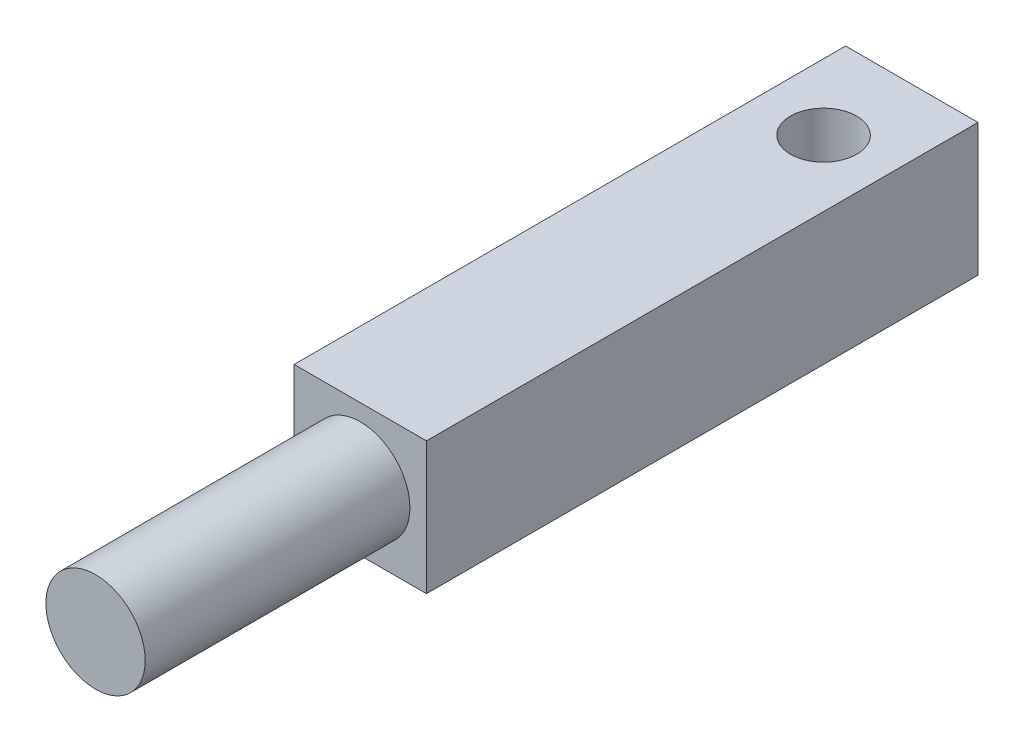
ISO-10303-21;
HEADER;
FILE_DESCRIPTION(('STEP AP214'),'2;1');
FILE_NAME('part.step','',(''),(''),'','','');
FILE_SCHEMA(('AUTOMOTIVE_DESIGN { 1 0 10303 214 1 1 1 1 }'));
ENDSEC;
DATA;
#1=APPLICATION_CONTEXT('core data for automotive mechanical design processes');
#2=APPLICATION_PROTOCOL_DEFINITION('international standard','automotive_design',2000,#1);
#3=PRODUCT_CONTEXT('',#1,'mechanical');
#4=PRODUCT('Part','Part','',(#3));
#5=PRODUCT_RELATED_PRODUCT_CATEGORY('part','',(#4));
#6=PRODUCT_DEFINITION_FORMATION('','',#4);
#7=PRODUCT_DEFINITION_CONTEXT('part definition',#1,'design');
#8=PRODUCT_DEFINITION('design','',#6,#7);
#9=PRODUCT_DEFINITION_SHAPE('','',#8);
#10=(LENGTH_UNIT() NAMED_UNIT(*) SI_UNIT(.MILLI.,.METRE.));
#11=(NAMED_UNIT(*) PLANE_ANGLE_UNIT() SI_UNIT($,.RADIAN.));
#12=(NAMED_UNIT(*) SI_UNIT($,.STERADIAN.) SOLID_ANGLE_UNIT());
#13=UNCERTAINTY_MEASURE_WITH_UNIT(LENGTH_MEASURE(1.E-05),#10,'distance_accuracy_value','');
#14=(GEOMETRIC_REPRESENTATION_CONTEXT(3) GLOBAL_UNCERTAINTY_ASSIGNED_CONTEXT((#13)) GLOBAL_UNIT_ASSIGNED_CONTEXT((#10,
#11,#12)) REPRESENTATION_CONTEXT('',''));
#15=CARTESIAN_POINT('',(0.,0.,0.));
#16=DIRECTION('',(0.,0.,1.));
#17=DIRECTION('',(1.,0.,0.));
#18=AXIS2_PLACEMENT_3D('',#15,#16,#17);
#19=CARTESIAN_POINT('',(6.,-6.,50.));
#20=DIRECTION('',(-1.,0.,0.));
#21=DIRECTION('',(0.,0.,1.));
#22=AXIS2_PLACEMENT_3D('',#19,#20,#21);
#23=PLANE('',#22);
#24=DIRECTION('',(0.,1.,0.));
#25=VECTOR('',#24,1.);
#26=CARTESIAN_POINT('',(6.,-6.,0.));
#27=LINE('',#26,#25);
#28=CARTESIAN_POINT('',(6.,-6.,0.));
#29=VERTEX_POINT('',#28);
#30=CARTESIAN_POINT('',(6.,6.,0.));
#31=VERTEX_POINT('',#30);
#32=EDGE_CURVE('E103',#29,#31,#27,.T.);
#33=ORIENTED_EDGE('',*,*,#32,.T.);
#34=DIRECTION('',(0.,0.,-1.));
#35=VECTOR('',#34,1.);
#36=CARTESIAN_POINT('',(6.,6.,50.));
#37=LINE('',#36,#35);
#38=CARTESIAN_POINT('',(6.,6.,50.));
#39=VERTEX_POINT('',#38);
#40=EDGE_CURVE('E40',#39,#31,#37,.T.);
#41=ORIENTED_EDGE('',*,*,#40,.F.);
#42=DIRECTION('',(0.,1.,0.));
#43=VECTOR('',#42,1.);
#44=CARTESIAN_POINT('',(6.,-6.,50.));
#45=LINE('',#44,#43);
#46=CARTESIAN_POINT('',(6.,-6.,50.));
#47=VERTEX_POINT('',#46);
#48=EDGE_CURVE('E90',#47,#39,#45,.T.);
#49=ORIENTED_EDGE('',*,*,#48,.F.);
#50=DIRECTION('',(0.,0.,-1.));
#51=VECTOR('',#50,1.);
#52=CARTESIAN_POINT('',(6.,-6.,50.));
#53=LINE('',#52,#51);
#54=EDGE_CURVE('E99',#47,#29,#53,.T.);
#55=ORIENTED_EDGE('',*,*,#54,.T.);
#56=EDGE_LOOP('',(#33,#41,#49,#55));
#57=FACE_BOUND('',#56,.T.);
#58=ADVANCED_FACE('F37',(#57),#23,.F.);
#59=CARTESIAN_POINT('',(-6.,6.,50.));
#60=DIRECTION('',(0.,-1.,0.));
#61=DIRECTION('',(0.,0.,-1.));
#62=AXIS2_PLACEMENT_3D('',#59,#60,#61);
#63=PLANE('',#62);
#64=CARTESIAN_POINT('',(0.,6.,8.));
#65=DIRECTION('',(0.,1.,0.));
#66=DIRECTION('',(0.,0.,1.));
#67=AXIS2_PLACEMENT_3D('',#64,#65,#66);
#68=CIRCLE('',#67,3.);
#69=CARTESIAN_POINT('',(0.,6.,11.));
#70=VERTEX_POINT('',#69);
#71=EDGE_CURVE('E120',#70,#70,#68,.T.);
#72=ORIENTED_EDGE('',*,*,#71,.F.);
#73=EDGE_LOOP('',(#72));
#74=FACE_BOUND('',#73,.T.);
#75=DIRECTION('',(-1.,0.,0.));
#76=VECTOR('',#75,1.);
#77=CARTESIAN_POINT('',(-6.,6.,0.));
#78=LINE('',#77,#76);
#79=CARTESIAN_POINT('',(-6.,6.,0.));
#80=VERTEX_POINT('',#79);
#81=EDGE_CURVE('E95',#31,#80,#78,.T.);
#82=ORIENTED_EDGE('',*,*,#81,.T.);
#83=DIRECTION('',(0.,0.,-1.));
#84=VECTOR('',#83,1.);
#85=CARTESIAN_POINT('',(-6.,6.,50.));
#86=LINE('',#85,#84);
#87=CARTESIAN_POINT('',(-6.,6.,50.));
#88=VERTEX_POINT('',#87);
#89=EDGE_CURVE('E93',#88,#80,#86,.T.);
#90=ORIENTED_EDGE('',*,*,#89,.F.);
#91=DIRECTION('',(-1.,0.,0.));
#92=VECTOR('',#91,1.);
#93=CARTESIAN_POINT('',(-6.,6.,50.));
#94=LINE('',#93,#92);
#95=EDGE_CURVE('E85',#39,#88,#94,.T.);
#96=ORIENTED_EDGE('',*,*,#95,.F.);
#97=ORIENTED_EDGE('',*,*,#40,.T.);
#98=EDGE_LOOP('',(#82,#90,#96,#97));
#99=FACE_BOUND('',#98,.T.);
#100=ADVANCED_FACE('F94',(#74,#99),#63,.F.);
#101=CARTESIAN_POINT('',(-6.,-6.,50.));
#102=DIRECTION('',(1.,0.,0.));
#103=DIRECTION('',(0.,0.,-1.));
#104=AXIS2_PLACEMENT_3D('',#101,#102,#103);
#105=PLANE('',#104);
#106=DIRECTION('',(0.,-1.,0.));
#107=VECTOR('',#106,1.);
#108=CARTESIAN_POINT('',(-6.,-6.,0.));
#109=LINE('',#108,#107);
#110=CARTESIAN_POINT('',(-6.,-6.,0.));
#111=VERTEX_POINT('',#110);
#112=EDGE_CURVE('E71',#80,#111,#109,.T.);
#113=ORIENTED_EDGE('',*,*,#112,.T.);
#114=DIRECTION('',(0.,0.,-1.));
#115=VECTOR('',#114,1.);
#116=CARTESIAN_POINT('',(-6.,-6.,50.));
#117=LINE('',#116,#115);
#118=CARTESIAN_POINT('',(-6.,-6.,50.));
#119=VERTEX_POINT('',#118);
#120=EDGE_CURVE('E96',#119,#111,#117,.T.);
#121=ORIENTED_EDGE('',*,*,#120,.F.);
#122=DIRECTION('',(0.,-1.,0.));
#123=VECTOR('',#122,1.);
#124=CARTESIAN_POINT('',(-6.,-6.,50.));
#125=LINE('',#124,#123);
#126=EDGE_CURVE('E88',#88,#119,#125,.T.);
#127=ORIENTED_EDGE('',*,*,#126,.F.);
#128=ORIENTED_EDGE('',*,*,#89,.T.);
#129=EDGE_LOOP('',(#113,#121,#127,#128));
#130=FACE_BOUND('',#129,.T.);
#131=ADVANCED_FACE('F97',(#130),#105,.F.);
#132=CARTESIAN_POINT('',(-6.,-6.,50.));
#133=DIRECTION('',(0.,1.,0.));
#134=DIRECTION('',(0.,0.,1.));
#135=AXIS2_PLACEMENT_3D('',#132,#133,#134);
#136=PLANE('',#135);
#137=CARTESIAN_POINT('',(0.,-6.,8.));
#138=DIRECTION('',(0.,1.,0.));
#139=DIRECTION('',(0.,0.,1.));
#140=AXIS2_PLACEMENT_3D('',#137,#138,#139);
#141=CIRCLE('',#140,3.);
#142=CARTESIAN_POINT('',(0.,-6.,11.));
#143=VERTEX_POINT('',#142);
#144=EDGE_CURVE('E119',#143,#143,#141,.T.);
#145=ORIENTED_EDGE('',*,*,#144,.T.);
#146=EDGE_LOOP('',(#145));
#147=FACE_BOUND('',#146,.T.);
#148=DIRECTION('',(1.,0.,0.));
#149=VECTOR('',#148,1.);
#150=CARTESIAN_POINT('',(-6.,-6.,0.));
#151=LINE('',#150,#149);
#152=EDGE_CURVE('E77',#111,#29,#151,.T.);
#153=ORIENTED_EDGE('',*,*,#152,.T.);
#154=ORIENTED_EDGE('',*,*,#54,.F.);
#155=DIRECTION('',(1.,0.,0.));
#156=VECTOR('',#155,1.);
#157=CARTESIAN_POINT('',(-6.,-6.,50.));
#158=LINE('',#157,#156);
#159=EDGE_CURVE('E54',#119,#47,#158,.T.);
#160=ORIENTED_EDGE('',*,*,#159,.F.);
#161=ORIENTED_EDGE('',*,*,#120,.T.);
#162=EDGE_LOOP('',(#153,#154,#160,#161));
#163=FACE_BOUND('',#162,.T.);
#164=ADVANCED_FACE('F111',(#147,#163),#136,.F.);
#165=CARTESIAN_POINT('',(0.,0.,50.));
#166=DIRECTION('',(0.,0.,-1.));
#167=DIRECTION('',(-1.,0.,0.));
#168=AXIS2_PLACEMENT_3D('',#165,#166,#167);
#169=PLANE('',#168);
#170=CARTESIAN_POINT('',(0.,0.,50.));
#171=DIRECTION('',(0.,0.,1.));
#172=DIRECTION('',(1.,0.,0.));
#173=AXIS2_PLACEMENT_3D('',#170,#171,#172);
#174=CIRCLE('',#173,4.5);
#175=CARTESIAN_POINT('',(4.5,0.,50.));
#176=VERTEX_POINT('',#175);
#177=EDGE_CURVE('E11',#176,#176,#174,.T.);
#178=ORIENTED_EDGE('',*,*,#177,.F.);
#179=EDGE_LOOP('',(#178));
#180=FACE_BOUND('',#179,.T.);
#181=ORIENTED_EDGE('',*,*,#48,.T.);
#182=ORIENTED_EDGE('',*,*,#95,.T.);
#183=ORIENTED_EDGE('',*,*,#126,.T.);
#184=ORIENTED_EDGE('',*,*,#159,.T.);
#185=EDGE_LOOP('',(#181,#182,#183,#184));
#186=FACE_BOUND('',#185,.T.);
#187=ADVANCED_FACE('F86',(#180,#186),#169,.F.);
#188=CARTESIAN_POINT('',(0.,0.,0.));
#189=DIRECTION('',(0.,0.,-1.));
#190=DIRECTION('',(-1.,0.,0.));
#191=AXIS2_PLACEMENT_3D('',#188,#189,#190);
#192=PLANE('',#191);
#193=ORIENTED_EDGE('',*,*,#32,.F.);
#194=ORIENTED_EDGE('',*,*,#152,.F.);
#195=ORIENTED_EDGE('',*,*,#112,.F.);
#196=ORIENTED_EDGE('',*,*,#81,.F.);
#197=EDGE_LOOP('',(#193,#194,#195,#196));
#198=FACE_BOUND('',#197,.T.);
#199=ADVANCED_FACE('F114',(#198),#192,.T.);
#200=CARTESIAN_POINT('',(0.,0.,74.));
#201=DIRECTION('',(0.,0.,-1.));
#202=DIRECTION('',(-1.,0.,0.));
#203=AXIS2_PLACEMENT_3D('',#200,#201,#202);
#204=CYLINDRICAL_SURFACE('',#203,4.5);
#205=CARTESIAN_POINT('',(0.,0.,74.));
#206=DIRECTION('',(0.,0.,1.));
#207=DIRECTION('',(1.,0.,0.));
#208=AXIS2_PLACEMENT_3D('',#205,#206,#207);
#209=CIRCLE('',#208,4.5);
#210=CARTESIAN_POINT('',(4.5,0.,74.));
#211=VERTEX_POINT('',#210);
#212=EDGE_CURVE('E106',#211,#211,#209,.T.);
#213=ORIENTED_EDGE('',*,*,#212,.F.);
#214=EDGE_LOOP('',(#213));
#215=FACE_BOUND('',#214,.T.);
#216=ORIENTED_EDGE('',*,*,#177,.T.);
#217=EDGE_LOOP('',(#216));
#218=FACE_BOUND('',#217,.T.);
#219=ADVANCED_FACE('F145',(#215,#218),#204,.T.);
#220=CARTESIAN_POINT('',(0.,0.,74.));
#221=DIRECTION('',(0.,0.,1.));
#222=DIRECTION('',(1.,0.,0.));
#223=AXIS2_PLACEMENT_3D('',#220,#221,#222);
#224=PLANE('',#223);
#225=ORIENTED_EDGE('',*,*,#212,.T.);
#226=EDGE_LOOP('',(#225));
#227=FACE_BOUND('',#226,.T.);
#228=ADVANCED_FACE('F130',(#227),#224,.T.);
#229=CARTESIAN_POINT('',(0.,-6.,8.));
#230=DIRECTION('',(0.,1.,0.));
#231=DIRECTION('',(0.,0.,1.));
#232=AXIS2_PLACEMENT_3D('',#229,#230,#231);
#233=CYLINDRICAL_SURFACE('',#232,3.);
#234=ORIENTED_EDGE('',*,*,#144,.F.);
#235=EDGE_LOOP('',(#234));
#236=FACE_BOUND('',#235,.T.);
#237=ORIENTED_EDGE('',*,*,#71,.T.);
#238=EDGE_LOOP('',(#237));
#239=FACE_BOUND('',#238,.T.);
#240=ADVANCED_FACE('F127',(#236,#239),#233,.F.);
#241=CLOSED_SHELL('',(#58,#100,#131,#164,#187,#199,#219,#228,#240));
#242=MANIFOLD_SOLID_BREP('B2',#241);
#243=ADVANCED_BREP_SHAPE_REPRESENTATION('',(#18,#242),#14);
#244=SHAPE_DEFINITION_REPRESENTATION(#9,#243);
ENDSEC;
END-ISO-10303-21;
